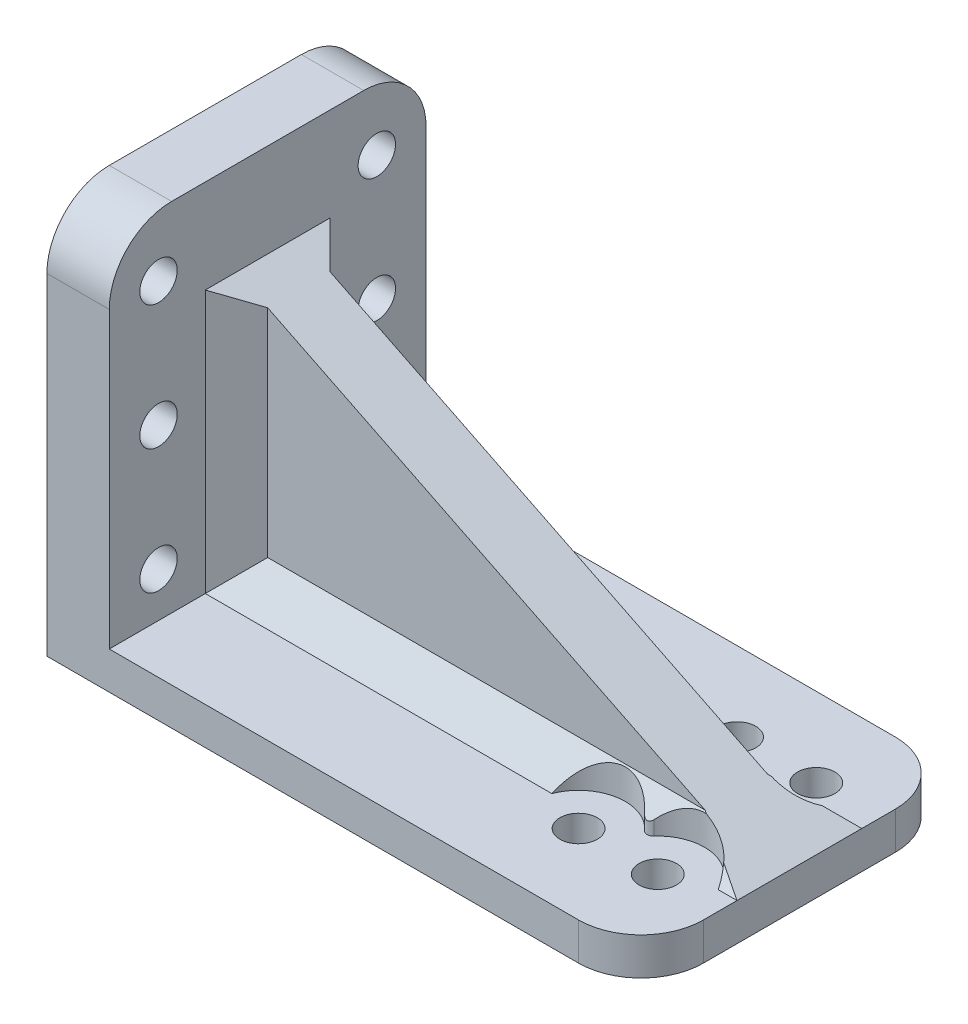
ISO-10303-21;
HEADER;
FILE_DESCRIPTION(('STEP AP214'),'2;1');
FILE_NAME('part.step','',(''),(''),'','','');
FILE_SCHEMA(('AUTOMOTIVE_DESIGN { 1 0 10303 214 1 1 1 1 }'));
ENDSEC;
DATA;
#1=APPLICATION_CONTEXT('core data for automotive mechanical design processes');
#2=APPLICATION_PROTOCOL_DEFINITION('international standard','automotive_design',2000,#1);
#3=PRODUCT_CONTEXT('',#1,'mechanical');
#4=PRODUCT('Part','Part','',(#3));
#5=PRODUCT_RELATED_PRODUCT_CATEGORY('part','',(#4));
#6=PRODUCT_DEFINITION_FORMATION('','',#4);
#7=PRODUCT_DEFINITION_CONTEXT('part definition',#1,'design');
#8=PRODUCT_DEFINITION('design','',#6,#7);
#9=PRODUCT_DEFINITION_SHAPE('','',#8);
#10=(LENGTH_UNIT() NAMED_UNIT(*) SI_UNIT(.MILLI.,.METRE.));
#11=(NAMED_UNIT(*) PLANE_ANGLE_UNIT() SI_UNIT($,.RADIAN.));
#12=(NAMED_UNIT(*) SI_UNIT($,.STERADIAN.) SOLID_ANGLE_UNIT());
#13=UNCERTAINTY_MEASURE_WITH_UNIT(LENGTH_MEASURE(1.E-05),#10,'distance_accuracy_value','');
#14=(GEOMETRIC_REPRESENTATION_CONTEXT(3) GLOBAL_UNCERTAINTY_ASSIGNED_CONTEXT((#13)) GLOBAL_UNIT_ASSIGNED_CONTEXT((#10,
#11,#12)) REPRESENTATION_CONTEXT('',''));
#15=CARTESIAN_POINT('',(0.,0.,0.));
#16=DIRECTION('',(0.,0.,1.));
#17=DIRECTION('',(1.,0.,0.));
#18=AXIS2_PLACEMENT_3D('',#15,#16,#17);
#19=CARTESIAN_POINT('',(0.,7.99999999999998,5.));
#20=DIRECTION('',(0.,0.707106781186551,0.707106781186544));
#21=DIRECTION('',(-1.,0.,0.));
#22=AXIS2_PLACEMENT_3D('',#19,#20,#21);
#23=PLANE('',#22);
#24=CARTESIAN_POINT('',(37.625,0.300000000000029,12.7));
#25=DIRECTION('',(0.,0.707106781186551,0.707106781186544));
#26=DIRECTION('',(0.,-0.707106781186544,0.707106781186551));
#27=AXIS2_PLACEMENT_3D('',#24,#25,#26);
#28=ELLIPSE('',#27,10.6066017177982,7.5);
#29=CARTESIAN_POINT('',(44.6221422738144,3.,10.));
#30=VERTEX_POINT('',#29);
#31=CARTESIAN_POINT('',(43.3948953454556,5.09148282919706,7.90851717080294));
#32=VERTEX_POINT('',#31);
#33=EDGE_CURVE('E266',#30,#32,#28,.T.);
#34=ORIENTED_EDGE('',*,*,#33,.F.);
#35=DIRECTION('',(-1.,0.,0.));
#36=VECTOR('',#35,1.);
#37=CARTESIAN_POINT('',(-37.625,3.,10.));
#38=LINE('',#37,#36);
#39=CARTESIAN_POINT('',(47.625,3.,10.));
#40=VERTEX_POINT('',#39);
#41=EDGE_CURVE('E216',#40,#30,#38,.T.);
#42=ORIENTED_EDGE('',*,*,#41,.F.);
#43=DIRECTION('',(0.819529426312242,-0.405198420164939,0.405198420164942));
#44=VECTOR('',#43,1.);
#45=CARTESIAN_POINT('',(12.3179733236176,20.4567879696131,-7.45678796961326));
#46=LINE('',#45,#44);
#47=EDGE_CURVE('E228',#32,#40,#46,.T.);
#48=ORIENTED_EDGE('',*,*,#47,.F.);
#49=EDGE_LOOP('',(#34,#42,#48));
#50=FACE_BOUND('',#49,.T.);
#51=ADVANCED_FACE('F37',(#50),#23,.T.);
#52=CARTESIAN_POINT('',(24.925,0.300000000000029,12.7));
#53=DIRECTION('',(0.,0.707106781186551,0.707106781186544));
#54=DIRECTION('',(0.,-0.707106781186544,0.707106781186551));
#55=AXIS2_PLACEMENT_3D('',#52,#53,#54);
#56=ELLIPSE('',#55,10.6066017177982,7.5);
#57=CARTESIAN_POINT('',(30.5279411764706,5.28568452401576,7.71431547598423));
#58=VERTEX_POINT('',#57);
#59=CARTESIAN_POINT('',(17.9278577261856,3.,10.));
#60=VERTEX_POINT('',#59);
#61=EDGE_CURVE('E204',#58,#60,#56,.T.);
#62=ORIENTED_EDGE('',*,*,#61,.F.);
#63=CARTESIAN_POINT('',(31.275,5.95044246055119,7.04955753944879));
#64=DIRECTION('',(0.,0.707106781186551,0.707106781186544));
#65=DIRECTION('',(0.,-0.707106781186544,0.707106781186551));
#66=AXIS2_PLACEMENT_3D('',#63,#64,#65);
#67=ELLIPSE('',#66,1.41421356237309,1.);
#68=CARTESIAN_POINT('',(32.0220588235294,5.28568452401576,7.71431547598423));
#69=VERTEX_POINT('',#68);
#70=EDGE_CURVE('E314',#58,#69,#67,.T.);
#71=ORIENTED_EDGE('',*,*,#70,.T.);
#72=CARTESIAN_POINT('',(37.9293061995151,7.79382397290837,5.20617602709161));
#73=VERTEX_POINT('',#72);
#74=EDGE_CURVE('E208',#73,#69,#28,.T.);
#75=ORIENTED_EDGE('',*,*,#74,.F.);
#76=CARTESIAN_POINT('',(37.5123072360617,7.99999999999998,5.));
#77=VERTEX_POINT('',#76);
#78=EDGE_CURVE('E229',#77,#73,#46,.T.);
#79=ORIENTED_EDGE('',*,*,#78,.F.);
#80=DIRECTION('',(1.,0.,0.));
#81=VECTOR('',#80,1.);
#82=CARTESIAN_POINT('',(47.625,7.99999999999998,5.));
#83=LINE('',#82,#81);
#84=CARTESIAN_POINT('',(-32.625,7.99999999999998,5.));
#85=VERTEX_POINT('',#84);
#86=EDGE_CURVE('E217',#85,#77,#83,.T.);
#87=ORIENTED_EDGE('',*,*,#86,.F.);
#88=DIRECTION('',(-0.577350269189624,-0.577350269189624,0.577350269189629));
#89=VECTOR('',#88,1.);
#90=CARTESIAN_POINT('',(-21.7500000000001,18.8749999999999,-5.87500000000004));
#91=LINE('',#90,#89);
#92=CARTESIAN_POINT('',(-37.625,3.,10.));
#93=VERTEX_POINT('',#92);
#94=EDGE_CURVE('E215',#85,#93,#91,.T.);
#95=ORIENTED_EDGE('',*,*,#94,.T.);
#96=EDGE_CURVE('E199',#60,#93,#38,.T.);
#97=ORIENTED_EDGE('',*,*,#96,.F.);
#98=EDGE_LOOP('',(#62,#71,#75,#79,#87,#95,#97));
#99=FACE_BOUND('',#98,.T.);
#100=ADVANCED_FACE('F212',(#99),#23,.T.);
#101=CARTESIAN_POINT('',(0.,3.,-10.));
#102=DIRECTION('',(0.,-0.70710678118655,0.707106781186545));
#103=DIRECTION('',(1.,0.,0.));
#104=AXIS2_PLACEMENT_3D('',#101,#102,#103);
#105=PLANE('',#104);
#106=CARTESIAN_POINT('',(37.625,0.300000000000036,-12.7));
#107=DIRECTION('',(0.,-0.70710678118655,0.707106781186545));
#108=DIRECTION('',(0.,-0.707106781186545,-0.70710678118655));
#109=AXIS2_PLACEMENT_3D('',#106,#107,#108);
#110=ELLIPSE('',#109,10.6066017177982,7.5);
#111=CARTESIAN_POINT('',(32.0220588235294,5.28568452401577,-7.71431547598423));
#112=VERTEX_POINT('',#111);
#113=CARTESIAN_POINT('',(37.9293061995151,7.79382397290838,-5.20617602709159));
#114=VERTEX_POINT('',#113);
#115=EDGE_CURVE('E261',#112,#114,#110,.F.);
#116=ORIENTED_EDGE('',*,*,#115,.F.);
#117=CARTESIAN_POINT('',(31.275,5.9504424605512,-7.04955753944879));
#118=DIRECTION('',(0.,-0.70710678118655,0.707106781186545));
#119=DIRECTION('',(0.,-0.707106781186545,-0.70710678118655));
#120=AXIS2_PLACEMENT_3D('',#117,#118,#119);
#121=ELLIPSE('',#120,1.41421356237309,1.);
#122=CARTESIAN_POINT('',(30.5279411764706,5.28568452401576,-7.71431547598423));
#123=VERTEX_POINT('',#122);
#124=EDGE_CURVE('E308',#112,#123,#121,.F.);
#125=ORIENTED_EDGE('',*,*,#124,.T.);
#126=CARTESIAN_POINT('',(24.925,0.300000000000036,-12.7));
#127=DIRECTION('',(0.,-0.70710678118655,0.707106781186545));
#128=DIRECTION('',(0.,-0.707106781186545,-0.70710678118655));
#129=AXIS2_PLACEMENT_3D('',#126,#127,#128);
#130=ELLIPSE('',#129,10.6066017177982,7.5);
#131=CARTESIAN_POINT('',(17.9278577261856,3.,-10.));
#132=VERTEX_POINT('',#131);
#133=EDGE_CURVE('E209',#132,#123,#130,.F.);
#134=ORIENTED_EDGE('',*,*,#133,.F.);
#135=DIRECTION('',(1.,0.,0.));
#136=VECTOR('',#135,1.);
#137=CARTESIAN_POINT('',(0.,3.,-10.));
#138=LINE('',#137,#136);
#139=CARTESIAN_POINT('',(-37.625,3.,-10.));
#140=VERTEX_POINT('',#139);
#141=EDGE_CURVE('E245',#140,#132,#138,.T.);
#142=ORIENTED_EDGE('',*,*,#141,.F.);
#143=DIRECTION('',(-0.577350269189624,-0.577350269189624,-0.577350269189629));
#144=VECTOR('',#143,1.);
#145=CARTESIAN_POINT('',(-25.7666666666667,14.8583333333333,1.85833333333336));
#146=LINE('',#145,#144);
#147=CARTESIAN_POINT('',(-32.625,7.99999999999998,-5.));
#148=VERTEX_POINT('',#147);
#149=EDGE_CURVE('E237',#148,#140,#146,.T.);
#150=ORIENTED_EDGE('',*,*,#149,.F.);
#151=DIRECTION('',(-1.,0.,0.));
#152=VECTOR('',#151,1.);
#153=CARTESIAN_POINT('',(0.,7.99999999999998,-5.));
#154=LINE('',#153,#152);
#155=CARTESIAN_POINT('',(37.5123072360617,7.99999999999998,-5.));
#156=VERTEX_POINT('',#155);
#157=EDGE_CURVE('E234',#156,#148,#154,.T.);
#158=ORIENTED_EDGE('',*,*,#157,.F.);
#159=DIRECTION('',(0.819529426312242,-0.405198420164939,-0.405198420164942));
#160=VECTOR('',#159,1.);
#161=CARTESIAN_POINT('',(15.6386936118216,18.8149303725715,5.81493037257162));
#162=LINE('',#161,#160);
#163=EDGE_CURVE('E251',#114,#156,#162,.F.);
#164=ORIENTED_EDGE('',*,*,#163,.F.);
#165=EDGE_LOOP('',(#116,#125,#134,#142,#150,#158,#164));
#166=FACE_BOUND('',#165,.T.);
#167=ADVANCED_FACE('F336',(#166),#105,.F.);
#168=CARTESIAN_POINT('',(43.3948953454556,5.09148282919704,-7.90851717080296));
#169=VERTEX_POINT('',#168);
#170=CARTESIAN_POINT('',(44.6221422738144,3.,-10.));
#171=VERTEX_POINT('',#170);
#172=EDGE_CURVE('E255',#169,#171,#110,.F.);
#173=ORIENTED_EDGE('',*,*,#172,.F.);
#174=CARTESIAN_POINT('',(47.625,3.,-10.));
#175=VERTEX_POINT('',#174);
#176=EDGE_CURVE('E252',#175,#169,#162,.F.);
#177=ORIENTED_EDGE('',*,*,#176,.F.);
#178=EDGE_CURVE('E244',#171,#175,#138,.T.);
#179=ORIENTED_EDGE('',*,*,#178,.F.);
#180=EDGE_LOOP('',(#173,#177,#179));
#181=FACE_BOUND('',#180,.T.);
#182=ADVANCED_FACE('F474',(#181),#105,.F.);
#183=CARTESIAN_POINT('',(24.925,-3.,-12.7));
#184=DIRECTION('',(0.,1.,0.));
#185=DIRECTION('',(0.,0.,1.));
#186=AXIS2_PLACEMENT_3D('',#183,#184,#185);
#187=CYLINDRICAL_SURFACE('',#186,3.);
#188=CARTESIAN_POINT('',(24.925,-3.,-12.7));
#189=DIRECTION('',(0.,1.,0.));
#190=DIRECTION('',(0.,0.,1.));
#191=AXIS2_PLACEMENT_3D('',#188,#189,#190);
#192=CIRCLE('',#191,3.);
#193=CARTESIAN_POINT('',(24.925,-3.,-9.7));
#194=VERTEX_POINT('',#193);
#195=EDGE_CURVE('E357',#194,#194,#192,.T.);
#196=ORIENTED_EDGE('',*,*,#195,.F.);
#197=EDGE_LOOP('',(#196));
#198=FACE_BOUND('',#197,.T.);
#199=CARTESIAN_POINT('',(24.925,3.,-12.7));
#200=DIRECTION('',(0.,1.,0.));
#201=DIRECTION('',(0.,0.,1.));
#202=AXIS2_PLACEMENT_3D('',#199,#200,#201);
#203=CIRCLE('',#202,3.);
#204=CARTESIAN_POINT('',(24.925,3.,-9.7));
#205=VERTEX_POINT('',#204);
#206=EDGE_CURVE('E365',#205,#205,#203,.T.);
#207=ORIENTED_EDGE('',*,*,#206,.T.);
#208=EDGE_LOOP('',(#207));
#209=FACE_BOUND('',#208,.T.);
#210=ADVANCED_FACE('F656',(#198,#209),#187,.F.);
#211=CARTESIAN_POINT('',(37.625,-3.,-12.7));
#212=DIRECTION('',(0.,1.,0.));
#213=DIRECTION('',(0.,0.,1.));
#214=AXIS2_PLACEMENT_3D('',#211,#212,#213);
#215=CYLINDRICAL_SURFACE('',#214,3.);
#216=CARTESIAN_POINT('',(37.625,-3.,-12.7));
#217=DIRECTION('',(0.,1.,0.));
#218=DIRECTION('',(0.,0.,1.));
#219=AXIS2_PLACEMENT_3D('',#216,#217,#218);
#220=CIRCLE('',#219,3.);
#221=CARTESIAN_POINT('',(37.625,-3.,-9.7));
#222=VERTEX_POINT('',#221);
#223=EDGE_CURVE('E353',#222,#222,#220,.T.);
#224=ORIENTED_EDGE('',*,*,#223,.F.);
#225=EDGE_LOOP('',(#224));
#226=FACE_BOUND('',#225,.T.);
#227=CARTESIAN_POINT('',(37.625,3.,-12.7));
#228=DIRECTION('',(0.,1.,0.));
#229=DIRECTION('',(0.,0.,1.));
#230=AXIS2_PLACEMENT_3D('',#227,#228,#229);
#231=CIRCLE('',#230,3.);
#232=CARTESIAN_POINT('',(37.625,3.,-9.7));
#233=VERTEX_POINT('',#232);
#234=EDGE_CURVE('E368',#233,#233,#231,.T.);
#235=ORIENTED_EDGE('',*,*,#234,.T.);
#236=EDGE_LOOP('',(#235));
#237=FACE_BOUND('',#236,.T.);
#238=ADVANCED_FACE('F659',(#226,#237),#215,.F.);
#239=CARTESIAN_POINT('',(24.925,-3.,12.7));
#240=DIRECTION('',(0.,1.,0.));
#241=DIRECTION('',(0.,0.,1.));
#242=AXIS2_PLACEMENT_3D('',#239,#240,#241);
#243=CYLINDRICAL_SURFACE('',#242,3.);
#244=CARTESIAN_POINT('',(24.925,-3.,12.7));
#245=DIRECTION('',(0.,1.,0.));
#246=DIRECTION('',(0.,0.,1.));
#247=AXIS2_PLACEMENT_3D('',#244,#245,#246);
#248=CIRCLE('',#247,3.);
#249=CARTESIAN_POINT('',(24.925,-3.,15.7));
#250=VERTEX_POINT('',#249);
#251=EDGE_CURVE('E354',#250,#250,#248,.T.);
#252=ORIENTED_EDGE('',*,*,#251,.F.);
#253=EDGE_LOOP('',(#252));
#254=FACE_BOUND('',#253,.T.);
#255=CARTESIAN_POINT('',(24.925,3.,12.7));
#256=DIRECTION('',(0.,1.,0.));
#257=DIRECTION('',(0.,0.,1.));
#258=AXIS2_PLACEMENT_3D('',#255,#256,#257);
#259=CIRCLE('',#258,3.);
#260=CARTESIAN_POINT('',(24.925,3.,15.7));
#261=VERTEX_POINT('',#260);
#262=EDGE_CURVE('E371',#261,#261,#259,.T.);
#263=ORIENTED_EDGE('',*,*,#262,.T.);
#264=EDGE_LOOP('',(#263));
#265=FACE_BOUND('',#264,.T.);
#266=ADVANCED_FACE('F667',(#254,#265),#243,.F.);
#267=CARTESIAN_POINT('',(37.625,-3.,12.7));
#268=DIRECTION('',(0.,1.,0.));
#269=DIRECTION('',(0.,0.,1.));
#270=AXIS2_PLACEMENT_3D('',#267,#268,#269);
#271=CYLINDRICAL_SURFACE('',#270,3.);
#272=CARTESIAN_POINT('',(37.625,-3.,12.7));
#273=DIRECTION('',(0.,1.,0.));
#274=DIRECTION('',(0.,0.,1.));
#275=AXIS2_PLACEMENT_3D('',#272,#273,#274);
#276=CIRCLE('',#275,3.);
#277=CARTESIAN_POINT('',(37.625,-3.,15.7));
#278=VERTEX_POINT('',#277);
#279=EDGE_CURVE('E358',#278,#278,#276,.T.);
#280=ORIENTED_EDGE('',*,*,#279,.F.);
#281=EDGE_LOOP('',(#280));
#282=FACE_BOUND('',#281,.T.);
#283=CARTESIAN_POINT('',(37.625,3.,12.7));
#284=DIRECTION('',(0.,1.,0.));
#285=DIRECTION('',(0.,0.,1.));
#286=AXIS2_PLACEMENT_3D('',#283,#284,#285);
#287=CIRCLE('',#286,3.);
#288=CARTESIAN_POINT('',(37.625,3.,15.7));
#289=VERTEX_POINT('',#288);
#290=EDGE_CURVE('E258',#289,#289,#287,.T.);
#291=ORIENTED_EDGE('',*,*,#290,.T.);
#292=EDGE_LOOP('',(#291));
#293=FACE_BOUND('',#292,.T.);
#294=ADVANCED_FACE('F663',(#282,#293),#271,.F.);
#295=CARTESIAN_POINT('',(0.,3.,25.4));
#296=DIRECTION('',(0.,1.,0.));
#297=DIRECTION('',(0.,0.,1.));
#298=AXIS2_PLACEMENT_3D('',#295,#296,#297);
#299=PLANE('',#298);
#300=DIRECTION('',(0.,0.,-1.));
#301=VECTOR('',#300,1.);
#302=CARTESIAN_POINT('',(47.625,3.,25.4));
#303=LINE('',#302,#301);
#304=CARTESIAN_POINT('',(47.625,3.,-15.4));
#305=VERTEX_POINT('',#304);
#306=EDGE_CURVE('E416',#175,#305,#303,.T.);
#307=ORIENTED_EDGE('',*,*,#306,.T.);
#308=CARTESIAN_POINT('',(37.625,3.,-15.4));
#309=DIRECTION('',(0.,1.,0.));
#310=DIRECTION('',(0.,0.,1.));
#311=AXIS2_PLACEMENT_3D('',#308,#309,#310);
#312=CIRCLE('',#311,10.);
#313=CARTESIAN_POINT('',(37.625,3.,-25.4));
#314=VERTEX_POINT('',#313);
#315=EDGE_CURVE('E279',#305,#314,#312,.T.);
#316=ORIENTED_EDGE('',*,*,#315,.T.);
#317=DIRECTION('',(1.,0.,0.));
#318=VECTOR('',#317,1.);
#319=CARTESIAN_POINT('',(0.,3.,-25.4));
#320=LINE('',#319,#318);
#321=CARTESIAN_POINT('',(-37.625,3.,-25.4));
#322=VERTEX_POINT('',#321);
#323=EDGE_CURVE('E403',#322,#314,#320,.T.);
#324=ORIENTED_EDGE('',*,*,#323,.F.);
#325=DIRECTION('',(0.,0.,-1.));
#326=VECTOR('',#325,1.);
#327=CARTESIAN_POINT('',(-37.625,3.,25.4));
#328=LINE('',#327,#326);
#329=EDGE_CURVE('E413',#140,#322,#328,.T.);
#330=ORIENTED_EDGE('',*,*,#329,.F.);
#331=ORIENTED_EDGE('',*,*,#141,.T.);
#332=CARTESIAN_POINT('',(24.925,3.,-12.7));
#333=DIRECTION('',(0.,1.,0.));
#334=DIRECTION('',(0.,0.,1.));
#335=AXIS2_PLACEMENT_3D('',#332,#333,#334);
#336=CIRCLE('',#335,7.5);
#337=CARTESIAN_POINT('',(30.5279411764706,3.,-7.71431547598423));
#338=VERTEX_POINT('',#337);
#339=EDGE_CURVE('E322',#132,#338,#336,.T.);
#340=ORIENTED_EDGE('',*,*,#339,.T.);
#341=CARTESIAN_POINT('',(31.275,3.,-7.04955753944879));
#342=DIRECTION('',(0.,1.,0.));
#343=DIRECTION('',(0.,0.,1.));
#344=AXIS2_PLACEMENT_3D('',#341,#342,#343);
#345=CIRCLE('',#344,1.);
#346=CARTESIAN_POINT('',(32.0220588235294,3.,-7.71431547598423));
#347=VERTEX_POINT('',#346);
#348=EDGE_CURVE('E45',#338,#347,#345,.F.);
#349=ORIENTED_EDGE('',*,*,#348,.T.);
#350=CARTESIAN_POINT('',(37.625,3.,-12.7));
#351=DIRECTION('',(0.,1.,0.));
#352=DIRECTION('',(0.,0.,1.));
#353=AXIS2_PLACEMENT_3D('',#350,#351,#352);
#354=CIRCLE('',#353,7.5);
#355=EDGE_CURVE('E321',#347,#171,#354,.T.);
#356=ORIENTED_EDGE('',*,*,#355,.T.);
#357=ORIENTED_EDGE('',*,*,#178,.T.);
#358=EDGE_LOOP('',(#307,#316,#324,#330,#331,#340,#349,#356,#357));
#359=FACE_BOUND('',#358,.T.);
#360=ORIENTED_EDGE('',*,*,#234,.F.);
#361=EDGE_LOOP('',(#360));
#362=FACE_BOUND('',#361,.T.);
#363=ORIENTED_EDGE('',*,*,#206,.F.);
#364=EDGE_LOOP('',(#363));
#365=FACE_BOUND('',#364,.T.);
#366=ADVANCED_FACE('F319',(#359,#362,#365),#299,.T.);
#367=CARTESIAN_POINT('',(-47.625,0.,25.4));
#368=DIRECTION('',(-1.,0.,0.));
#369=DIRECTION('',(0.,0.,1.));
#370=AXIS2_PLACEMENT_3D('',#367,#368,#369);
#371=PLANE('',#370);
#372=CARTESIAN_POINT('',(-47.625,50.15,-17.5));
#373=DIRECTION('',(-1.,0.,0.));
#374=DIRECTION('',(0.,0.,1.));
#375=AXIS2_PLACEMENT_3D('',#372,#373,#374);
#376=CIRCLE('',#375,3.);
#377=CARTESIAN_POINT('',(-47.625,50.15,-14.5));
#378=VERTEX_POINT('',#377);
#379=EDGE_CURVE('E501',#378,#378,#376,.F.);
#380=ORIENTED_EDGE('',*,*,#379,.T.);
#381=EDGE_LOOP('',(#380));
#382=FACE_BOUND('',#381,.T.);
#383=CARTESIAN_POINT('',(-47.625,30.15,-17.5));
#384=DIRECTION('',(-1.,0.,0.));
#385=DIRECTION('',(0.,0.,1.));
#386=AXIS2_PLACEMENT_3D('',#383,#384,#385);
#387=CIRCLE('',#386,3.);
#388=CARTESIAN_POINT('',(-47.625,30.15,-14.5));
#389=VERTEX_POINT('',#388);
#390=EDGE_CURVE('E495',#389,#389,#387,.F.);
#391=ORIENTED_EDGE('',*,*,#390,.T.);
#392=EDGE_LOOP('',(#391));
#393=FACE_BOUND('',#392,.T.);
#394=CARTESIAN_POINT('',(-47.625,30.15,17.5));
#395=DIRECTION('',(-1.,0.,0.));
#396=DIRECTION('',(0.,0.,1.));
#397=AXIS2_PLACEMENT_3D('',#394,#395,#396);
#398=CIRCLE('',#397,3.);
#399=CARTESIAN_POINT('',(-47.625,30.15,20.5));
#400=VERTEX_POINT('',#399);
#401=EDGE_CURVE('E489',#400,#400,#398,.F.);
#402=ORIENTED_EDGE('',*,*,#401,.T.);
#403=EDGE_LOOP('',(#402));
#404=FACE_BOUND('',#403,.T.);
#405=CARTESIAN_POINT('',(-47.625,10.15,17.5));
#406=DIRECTION('',(-1.,0.,0.));
#407=DIRECTION('',(0.,0.,1.));
#408=AXIS2_PLACEMENT_3D('',#405,#406,#407);
#409=CIRCLE('',#408,3.);
#410=CARTESIAN_POINT('',(-47.625,10.15,20.5));
#411=VERTEX_POINT('',#410);
#412=EDGE_CURVE('E482',#411,#411,#409,.F.);
#413=ORIENTED_EDGE('',*,*,#412,.T.);
#414=EDGE_LOOP('',(#413));
#415=FACE_BOUND('',#414,.T.);
#416=CARTESIAN_POINT('',(-47.625,10.15,-17.5));
#417=DIRECTION('',(-1.,0.,0.));
#418=DIRECTION('',(0.,0.,1.));
#419=AXIS2_PLACEMENT_3D('',#416,#417,#418);
#420=CIRCLE('',#419,3.);
#421=CARTESIAN_POINT('',(-47.625,10.15,-14.5));
#422=VERTEX_POINT('',#421);
#423=EDGE_CURVE('E506',#422,#422,#420,.F.);
#424=ORIENTED_EDGE('',*,*,#423,.T.);
#425=EDGE_LOOP('',(#424));
#426=FACE_BOUND('',#425,.T.);
#427=CARTESIAN_POINT('',(-47.625,50.15,17.5));
#428=DIRECTION('',(-1.,0.,0.));
#429=DIRECTION('',(0.,0.,1.));
#430=AXIS2_PLACEMENT_3D('',#427,#428,#429);
#431=CIRCLE('',#430,3.);
#432=CARTESIAN_POINT('',(-47.625,50.15,20.5));
#433=VERTEX_POINT('',#432);
#434=EDGE_CURVE('E344',#433,#433,#431,.F.);
#435=ORIENTED_EDGE('',*,*,#434,.T.);
#436=EDGE_LOOP('',(#435));
#437=FACE_BOUND('',#436,.T.);
#438=DIRECTION('',(0.,0.,-1.));
#439=VECTOR('',#438,1.);
#440=CARTESIAN_POINT('',(-47.625,60.15,25.4));
#441=LINE('',#440,#439);
#442=CARTESIAN_POINT('',(-47.625,60.15,15.4));
#443=VERTEX_POINT('',#442);
#444=CARTESIAN_POINT('',(-47.625,60.15,-15.4));
#445=VERTEX_POINT('',#444);
#446=EDGE_CURVE('E397',#443,#445,#441,.T.);
#447=ORIENTED_EDGE('',*,*,#446,.T.);
#448=CARTESIAN_POINT('',(-47.625,50.15,-15.4));
#449=DIRECTION('',(-1.,0.,0.));
#450=DIRECTION('',(0.,0.,1.));
#451=AXIS2_PLACEMENT_3D('',#448,#449,#450);
#452=CIRCLE('',#451,10.);
#453=CARTESIAN_POINT('',(-47.625,50.15,-25.4));
#454=VERTEX_POINT('',#453);
#455=EDGE_CURVE('E299',#445,#454,#452,.T.);
#456=ORIENTED_EDGE('',*,*,#455,.T.);
#457=DIRECTION('',(0.,1.,0.));
#458=VECTOR('',#457,1.);
#459=CARTESIAN_POINT('',(-47.625,0.,-25.4));
#460=LINE('',#459,#458);
#461=CARTESIAN_POINT('',(-47.625,-3.,-25.4));
#462=VERTEX_POINT('',#461);
#463=EDGE_CURVE('E384',#462,#454,#460,.T.);
#464=ORIENTED_EDGE('',*,*,#463,.F.);
#465=DIRECTION('',(0.,0.,-1.));
#466=VECTOR('',#465,1.);
#467=CARTESIAN_POINT('',(-47.625,-3.,25.4));
#468=LINE('',#467,#466);
#469=CARTESIAN_POINT('',(-47.625,-3.,25.4));
#470=VERTEX_POINT('',#469);
#471=EDGE_CURVE('E422',#470,#462,#468,.T.);
#472=ORIENTED_EDGE('',*,*,#471,.F.);
#473=DIRECTION('',(0.,1.,0.));
#474=VECTOR('',#473,1.);
#475=CARTESIAN_POINT('',(-47.625,0.,25.4));
#476=LINE('',#475,#474);
#477=CARTESIAN_POINT('',(-47.625,50.15,25.4));
#478=VERTEX_POINT('',#477);
#479=EDGE_CURVE('E385',#470,#478,#476,.T.);
#480=ORIENTED_EDGE('',*,*,#479,.T.);
#481=CARTESIAN_POINT('',(-47.625,50.15,15.4));
#482=DIRECTION('',(-1.,0.,0.));
#483=DIRECTION('',(0.,0.,1.));
#484=AXIS2_PLACEMENT_3D('',#481,#482,#483);
#485=CIRCLE('',#484,10.);
#486=EDGE_CURVE('E297',#478,#443,#485,.T.);
#487=ORIENTED_EDGE('',*,*,#486,.T.);
#488=EDGE_LOOP('',(#447,#456,#464,#472,#480,#487));
#489=FACE_BOUND('',#488,.T.);
#490=ADVANCED_FACE('F551',(#382,#393,#404,#415,#426,#437,#489),#371,.T.);
#491=CARTESIAN_POINT('',(0.,-3.,25.4));
#492=DIRECTION('',(0.,1.,0.));
#493=DIRECTION('',(0.,0.,1.));
#494=AXIS2_PLACEMENT_3D('',#491,#492,#493);
#495=PLANE('',#494);
#496=ORIENTED_EDGE('',*,*,#223,.T.);
#497=EDGE_LOOP('',(#496));
#498=FACE_BOUND('',#497,.T.);
#499=ORIENTED_EDGE('',*,*,#279,.T.);
#500=EDGE_LOOP('',(#499));
#501=FACE_BOUND('',#500,.T.);
#502=ORIENTED_EDGE('',*,*,#251,.T.);
#503=EDGE_LOOP('',(#502));
#504=FACE_BOUND('',#503,.T.);
#505=ORIENTED_EDGE('',*,*,#195,.T.);
#506=EDGE_LOOP('',(#505));
#507=FACE_BOUND('',#506,.T.);
#508=DIRECTION('',(1.,0.,0.));
#509=VECTOR('',#508,1.);
#510=CARTESIAN_POINT('',(0.,-3.,-25.4));
#511=LINE('',#510,#509);
#512=CARTESIAN_POINT('',(37.625,-3.,-25.4));
#513=VERTEX_POINT('',#512);
#514=EDGE_CURVE('E400',#462,#513,#511,.T.);
#515=ORIENTED_EDGE('',*,*,#514,.T.);
#516=CARTESIAN_POINT('',(37.625,-3.,-15.4));
#517=DIRECTION('',(0.,1.,0.));
#518=DIRECTION('',(0.,0.,1.));
#519=AXIS2_PLACEMENT_3D('',#516,#517,#518);
#520=CIRCLE('',#519,10.);
#521=CARTESIAN_POINT('',(47.625,-3.,-15.4));
#522=VERTEX_POINT('',#521);
#523=EDGE_CURVE('E272',#513,#522,#520,.F.);
#524=ORIENTED_EDGE('',*,*,#523,.T.);
#525=DIRECTION('',(0.,0.,-1.));
#526=VECTOR('',#525,1.);
#527=CARTESIAN_POINT('',(47.625,-3.,25.4));
#528=LINE('',#527,#526);
#529=CARTESIAN_POINT('',(47.625,-3.,15.4));
#530=VERTEX_POINT('',#529);
#531=EDGE_CURVE('E419',#530,#522,#528,.T.);
#532=ORIENTED_EDGE('',*,*,#531,.F.);
#533=CARTESIAN_POINT('',(37.625,-3.,15.4));
#534=DIRECTION('',(0.,1.,0.));
#535=DIRECTION('',(0.,0.,1.));
#536=AXIS2_PLACEMENT_3D('',#533,#534,#535);
#537=CIRCLE('',#536,10.);
#538=CARTESIAN_POINT('',(37.625,-3.,25.4));
#539=VERTEX_POINT('',#538);
#540=EDGE_CURVE('E270',#530,#539,#537,.F.);
#541=ORIENTED_EDGE('',*,*,#540,.T.);
#542=DIRECTION('',(1.,0.,0.));
#543=VECTOR('',#542,1.);
#544=CARTESIAN_POINT('',(0.,-3.,25.4));
#545=LINE('',#544,#543);
#546=EDGE_CURVE('E388',#470,#539,#545,.T.);
#547=ORIENTED_EDGE('',*,*,#546,.F.);
#548=ORIENTED_EDGE('',*,*,#471,.T.);
#549=EDGE_LOOP('',(#515,#524,#532,#541,#547,#548));
#550=FACE_BOUND('',#549,.T.);
#551=ADVANCED_FACE('F457',(#498,#501,#504,#507,#550),#495,.F.);
#552=CARTESIAN_POINT('',(47.625,0.,25.4));
#553=DIRECTION('',(1.,0.,0.));
#554=DIRECTION('',(0.,0.,-1.));
#555=AXIS2_PLACEMENT_3D('',#552,#553,#554);
#556=PLANE('',#555);
#557=ORIENTED_EDGE('',*,*,#531,.T.);
#558=DIRECTION('',(0.,-1.,0.));
#559=VECTOR('',#558,1.);
#560=CARTESIAN_POINT('',(47.625,3.,-15.4));
#561=LINE('',#560,#559);
#562=EDGE_CURVE('E277',#522,#305,#561,.F.);
#563=ORIENTED_EDGE('',*,*,#562,.T.);
#564=ORIENTED_EDGE('',*,*,#306,.F.);
#565=DIRECTION('',(0.,0.,1.));
#566=VECTOR('',#565,1.);
#567=CARTESIAN_POINT('',(47.625,3.,25.4));
#568=LINE('',#567,#566);
#569=EDGE_CURVE('E379',#40,#175,#568,.F.);
#570=ORIENTED_EDGE('',*,*,#569,.F.);
#571=CARTESIAN_POINT('',(47.625,3.,15.4));
#572=VERTEX_POINT('',#571);
#573=EDGE_CURVE('E417',#572,#40,#303,.T.);
#574=ORIENTED_EDGE('',*,*,#573,.F.);
#575=DIRECTION('',(0.,-1.,0.));
#576=VECTOR('',#575,1.);
#577=CARTESIAN_POINT('',(47.625,0.,15.4));
#578=LINE('',#577,#576);
#579=EDGE_CURVE('E274',#572,#530,#578,.T.);
#580=ORIENTED_EDGE('',*,*,#579,.T.);
#581=EDGE_LOOP('',(#557,#563,#564,#570,#574,#580));
#582=FACE_BOUND('',#581,.T.);
#583=ADVANCED_FACE('F453',(#582),#556,.T.);
#584=DIRECTION('',(1.,0.,0.));
#585=VECTOR('',#584,1.);
#586=CARTESIAN_POINT('',(0.,3.,25.4));
#587=LINE('',#586,#585);
#588=CARTESIAN_POINT('',(-37.625,3.,25.4));
#589=VERTEX_POINT('',#588);
#590=CARTESIAN_POINT('',(37.625,3.,25.4));
#591=VERTEX_POINT('',#590);
#592=EDGE_CURVE('E392',#589,#591,#587,.T.);
#593=ORIENTED_EDGE('',*,*,#592,.T.);
#594=CARTESIAN_POINT('',(37.625,3.,15.4));
#595=DIRECTION('',(0.,1.,0.));
#596=DIRECTION('',(0.,0.,1.));
#597=AXIS2_PLACEMENT_3D('',#594,#595,#596);
#598=CIRCLE('',#597,10.);
#599=EDGE_CURVE('E283',#591,#572,#598,.T.);
#600=ORIENTED_EDGE('',*,*,#599,.T.);
#601=ORIENTED_EDGE('',*,*,#573,.T.);
#602=ORIENTED_EDGE('',*,*,#41,.T.);
#603=CARTESIAN_POINT('',(37.625,3.,12.7));
#604=DIRECTION('',(0.,1.,0.));
#605=DIRECTION('',(0.,0.,1.));
#606=AXIS2_PLACEMENT_3D('',#603,#604,#605);
#607=CIRCLE('',#606,7.5);
#608=CARTESIAN_POINT('',(32.0220588235294,3.,7.71431547598423));
#609=VERTEX_POINT('',#608);
#610=EDGE_CURVE('E202',#30,#609,#607,.T.);
#611=ORIENTED_EDGE('',*,*,#610,.T.);
#612=CARTESIAN_POINT('',(31.275,3.,7.04955753944879));
#613=DIRECTION('',(0.,1.,0.));
#614=DIRECTION('',(0.,0.,1.));
#615=AXIS2_PLACEMENT_3D('',#612,#613,#614);
#616=CIRCLE('',#615,1.);
#617=CARTESIAN_POINT('',(30.5279411764706,3.,7.71431547598423));
#618=VERTEX_POINT('',#617);
#619=EDGE_CURVE('E11',#609,#618,#616,.F.);
#620=ORIENTED_EDGE('',*,*,#619,.T.);
#621=CARTESIAN_POINT('',(24.925,3.,12.7));
#622=DIRECTION('',(0.,1.,0.));
#623=DIRECTION('',(0.,0.,1.));
#624=AXIS2_PLACEMENT_3D('',#621,#622,#623);
#625=CIRCLE('',#624,7.5);
#626=EDGE_CURVE('E194',#618,#60,#625,.T.);
#627=ORIENTED_EDGE('',*,*,#626,.T.);
#628=ORIENTED_EDGE('',*,*,#96,.T.);
#629=EDGE_CURVE('E414',#589,#93,#328,.T.);
#630=ORIENTED_EDGE('',*,*,#629,.F.);
#631=EDGE_LOOP('',(#593,#600,#601,#602,#611,#620,#627,#628,#630));
#632=FACE_BOUND('',#631,.T.);
#633=ORIENTED_EDGE('',*,*,#262,.F.);
#634=EDGE_LOOP('',(#633));
#635=FACE_BOUND('',#634,.T.);
#636=ORIENTED_EDGE('',*,*,#290,.F.);
#637=EDGE_LOOP('',(#636));
#638=FACE_BOUND('',#637,.T.);
#639=ADVANCED_FACE('F196',(#632,#635,#638),#299,.T.);
#640=CARTESIAN_POINT('',(-37.625,0.,25.4));
#641=DIRECTION('',(-1.,0.,0.));
#642=DIRECTION('',(0.,-1.,0.));
#643=AXIS2_PLACEMENT_3D('',#640,#641,#642);
#644=PLANE('',#643);
#645=CARTESIAN_POINT('',(-37.625,50.15,-17.5));
#646=DIRECTION('',(1.,0.,0.));
#647=DIRECTION('',(0.,1.,0.));
#648=AXIS2_PLACEMENT_3D('',#645,#646,#647);
#649=CIRCLE('',#648,3.);
#650=CARTESIAN_POINT('',(-37.625,53.15,-17.5));
#651=VERTEX_POINT('',#650);
#652=EDGE_CURVE('E480',#651,#651,#649,.T.);
#653=ORIENTED_EDGE('',*,*,#652,.F.);
#654=EDGE_LOOP('',(#653));
#655=FACE_BOUND('',#654,.T.);
#656=CARTESIAN_POINT('',(-37.625,30.15,-17.5));
#657=DIRECTION('',(1.,0.,0.));
#658=DIRECTION('',(0.,1.,0.));
#659=AXIS2_PLACEMENT_3D('',#656,#657,#658);
#660=CIRCLE('',#659,3.);
#661=CARTESIAN_POINT('',(-37.625,33.15,-17.5));
#662=VERTEX_POINT('',#661);
#663=EDGE_CURVE('E498',#662,#662,#660,.T.);
#664=ORIENTED_EDGE('',*,*,#663,.F.);
#665=EDGE_LOOP('',(#664));
#666=FACE_BOUND('',#665,.T.);
#667=CARTESIAN_POINT('',(-37.625,30.15,17.5));
#668=DIRECTION('',(1.,0.,0.));
#669=DIRECTION('',(0.,1.,0.));
#670=AXIS2_PLACEMENT_3D('',#667,#668,#669);
#671=CIRCLE('',#670,3.);
#672=CARTESIAN_POINT('',(-37.625,33.15,17.5));
#673=VERTEX_POINT('',#672);
#674=EDGE_CURVE('E492',#673,#673,#671,.T.);
#675=ORIENTED_EDGE('',*,*,#674,.F.);
#676=EDGE_LOOP('',(#675));
#677=FACE_BOUND('',#676,.T.);
#678=CARTESIAN_POINT('',(-37.625,10.15,17.5));
#679=DIRECTION('',(1.,0.,0.));
#680=DIRECTION('',(0.,1.,0.));
#681=AXIS2_PLACEMENT_3D('',#678,#679,#680);
#682=CIRCLE('',#681,3.);
#683=CARTESIAN_POINT('',(-37.625,13.15,17.5));
#684=VERTEX_POINT('',#683);
#685=EDGE_CURVE('E485',#684,#684,#682,.T.);
#686=ORIENTED_EDGE('',*,*,#685,.F.);
#687=EDGE_LOOP('',(#686));
#688=FACE_BOUND('',#687,.T.);
#689=CARTESIAN_POINT('',(-37.625,10.15,-17.5));
#690=DIRECTION('',(1.,0.,0.));
#691=DIRECTION('',(0.,1.,0.));
#692=AXIS2_PLACEMENT_3D('',#689,#690,#691);
#693=CIRCLE('',#692,3.);
#694=CARTESIAN_POINT('',(-37.625,13.15,-17.5));
#695=VERTEX_POINT('',#694);
#696=EDGE_CURVE('E486',#695,#695,#693,.T.);
#697=ORIENTED_EDGE('',*,*,#696,.F.);
#698=EDGE_LOOP('',(#697));
#699=FACE_BOUND('',#698,.T.);
#700=CARTESIAN_POINT('',(-37.625,50.15,17.5));
#701=DIRECTION('',(1.,0.,0.));
#702=DIRECTION('',(0.,1.,0.));
#703=AXIS2_PLACEMENT_3D('',#700,#701,#702);
#704=CIRCLE('',#703,3.);
#705=CARTESIAN_POINT('',(-37.625,53.15,17.5));
#706=VERTEX_POINT('',#705);
#707=EDGE_CURVE('E341',#706,#706,#704,.T.);
#708=ORIENTED_EDGE('',*,*,#707,.F.);
#709=EDGE_LOOP('',(#708));
#710=FACE_BOUND('',#709,.T.);
#711=DIRECTION('',(0.,1.,0.));
#712=VECTOR('',#711,1.);
#713=CARTESIAN_POINT('',(-37.625,0.,-25.4));
#714=LINE('',#713,#712);
#715=CARTESIAN_POINT('',(-37.625,50.15,-25.4));
#716=VERTEX_POINT('',#715);
#717=EDGE_CURVE('E389',#322,#716,#714,.T.);
#718=ORIENTED_EDGE('',*,*,#717,.T.);
#719=CARTESIAN_POINT('',(-37.625,50.15,-15.4));
#720=DIRECTION('',(-1.,0.,0.));
#721=DIRECTION('',(0.,-1.,0.));
#722=AXIS2_PLACEMENT_3D('',#719,#720,#721);
#723=CIRCLE('',#722,10.);
#724=CARTESIAN_POINT('',(-37.625,60.15,-15.4));
#725=VERTEX_POINT('',#724);
#726=EDGE_CURVE('E290',#716,#725,#723,.F.);
#727=ORIENTED_EDGE('',*,*,#726,.T.);
#728=DIRECTION('',(0.,0.,-1.));
#729=VECTOR('',#728,1.);
#730=CARTESIAN_POINT('',(-37.625,60.15,25.4));
#731=LINE('',#730,#729);
#732=CARTESIAN_POINT('',(-37.625,60.15,15.4));
#733=VERTEX_POINT('',#732);
#734=EDGE_CURVE('E410',#733,#725,#731,.T.);
#735=ORIENTED_EDGE('',*,*,#734,.F.);
#736=CARTESIAN_POINT('',(-37.625,50.15,15.4));
#737=DIRECTION('',(-1.,0.,0.));
#738=DIRECTION('',(0.,-1.,0.));
#739=AXIS2_PLACEMENT_3D('',#736,#737,#738);
#740=CIRCLE('',#739,10.);
#741=CARTESIAN_POINT('',(-37.625,50.15,25.4));
#742=VERTEX_POINT('',#741);
#743=EDGE_CURVE('E288',#733,#742,#740,.F.);
#744=ORIENTED_EDGE('',*,*,#743,.T.);
#745=DIRECTION('',(0.,1.,0.));
#746=VECTOR('',#745,1.);
#747=CARTESIAN_POINT('',(-37.625,0.,25.4));
#748=LINE('',#747,#746);
#749=EDGE_CURVE('E394',#589,#742,#748,.T.);
#750=ORIENTED_EDGE('',*,*,#749,.F.);
#751=ORIENTED_EDGE('',*,*,#629,.T.);
#752=DIRECTION('',(0.,1.,0.));
#753=VECTOR('',#752,1.);
#754=CARTESIAN_POINT('',(-37.625,0.,10.));
#755=LINE('',#754,#753);
#756=CARTESIAN_POINT('',(-37.625,45.15,10.));
#757=VERTEX_POINT('',#756);
#758=EDGE_CURVE('E220',#93,#757,#755,.T.);
#759=ORIENTED_EDGE('',*,*,#758,.T.);
#760=DIRECTION('',(0.,0.,1.));
#761=VECTOR('',#760,1.);
#762=CARTESIAN_POINT('',(-37.625,45.15,25.4));
#763=LINE('',#762,#761);
#764=CARTESIAN_POINT('',(-37.625,45.15,-10.));
#765=VERTEX_POINT('',#764);
#766=EDGE_CURVE('E424',#757,#765,#763,.F.);
#767=ORIENTED_EDGE('',*,*,#766,.T.);
#768=DIRECTION('',(0.,-1.,0.));
#769=VECTOR('',#768,1.);
#770=CARTESIAN_POINT('',(-37.625,3.,-10.));
#771=LINE('',#770,#769);
#772=EDGE_CURVE('E242',#765,#140,#771,.T.);
#773=ORIENTED_EDGE('',*,*,#772,.T.);
#774=ORIENTED_EDGE('',*,*,#329,.T.);
#775=EDGE_LOOP('',(#718,#727,#735,#744,#750,#751,#759,#767,#773,#774));
#776=FACE_BOUND('',#775,.T.);
#777=ADVANCED_FACE('F441',(#655,#666,#677,#688,#699,#710,#776),#644,.F.);
#778=CARTESIAN_POINT('',(0.,60.15,25.4));
#779=DIRECTION('',(0.,1.,0.));
#780=DIRECTION('',(0.,0.,1.));
#781=AXIS2_PLACEMENT_3D('',#778,#779,#780);
#782=PLANE('',#781);
#783=ORIENTED_EDGE('',*,*,#734,.T.);
#784=DIRECTION('',(1.,0.,0.));
#785=VECTOR('',#784,1.);
#786=CARTESIAN_POINT('',(-47.625,60.15,-15.4));
#787=LINE('',#786,#785);
#788=EDGE_CURVE('E295',#725,#445,#787,.F.);
#789=ORIENTED_EDGE('',*,*,#788,.T.);
#790=ORIENTED_EDGE('',*,*,#446,.F.);
#791=DIRECTION('',(1.,0.,0.));
#792=VECTOR('',#791,1.);
#793=CARTESIAN_POINT('',(0.,60.15,15.4));
#794=LINE('',#793,#792);
#795=EDGE_CURVE('E292',#443,#733,#794,.T.);
#796=ORIENTED_EDGE('',*,*,#795,.T.);
#797=EDGE_LOOP('',(#783,#789,#790,#796));
#798=FACE_BOUND('',#797,.T.);
#799=ADVANCED_FACE('F516',(#798),#782,.T.);
#800=CARTESIAN_POINT('',(0.,0.,25.4));
#801=DIRECTION('',(0.,0.,1.));
#802=DIRECTION('',(1.,0.,0.));
#803=AXIS2_PLACEMENT_3D('',#800,#801,#802);
#804=PLANE('',#803);
#805=ORIENTED_EDGE('',*,*,#749,.T.);
#806=DIRECTION('',(1.,0.,0.));
#807=VECTOR('',#806,1.);
#808=CARTESIAN_POINT('',(0.,50.15,25.4));
#809=LINE('',#808,#807);
#810=EDGE_CURVE('E301',#742,#478,#809,.F.);
#811=ORIENTED_EDGE('',*,*,#810,.T.);
#812=ORIENTED_EDGE('',*,*,#479,.F.);
#813=ORIENTED_EDGE('',*,*,#546,.T.);
#814=DIRECTION('',(0.,-1.,0.));
#815=VECTOR('',#814,1.);
#816=CARTESIAN_POINT('',(37.625,0.,25.4));
#817=LINE('',#816,#815);
#818=EDGE_CURVE('E281',#539,#591,#817,.F.);
#819=ORIENTED_EDGE('',*,*,#818,.T.);
#820=ORIENTED_EDGE('',*,*,#592,.F.);
#821=EDGE_LOOP('',(#805,#811,#812,#813,#819,#820));
#822=FACE_BOUND('',#821,.T.);
#823=ADVANCED_FACE('F634',(#822),#804,.T.);
#824=CARTESIAN_POINT('',(0.,0.,-25.4));
#825=DIRECTION('',(0.,0.,1.));
#826=DIRECTION('',(1.,0.,0.));
#827=AXIS2_PLACEMENT_3D('',#824,#825,#826);
#828=PLANE('',#827);
#829=ORIENTED_EDGE('',*,*,#463,.T.);
#830=DIRECTION('',(1.,0.,0.));
#831=VECTOR('',#830,1.);
#832=CARTESIAN_POINT('',(-37.625,50.15,-25.4));
#833=LINE('',#832,#831);
#834=EDGE_CURVE('E285',#454,#716,#833,.T.);
#835=ORIENTED_EDGE('',*,*,#834,.T.);
#836=ORIENTED_EDGE('',*,*,#717,.F.);
#837=ORIENTED_EDGE('',*,*,#323,.T.);
#838=DIRECTION('',(0.,-1.,0.));
#839=VECTOR('',#838,1.);
#840=CARTESIAN_POINT('',(37.625,-3.,-25.4));
#841=LINE('',#840,#839);
#842=EDGE_CURVE('E267',#314,#513,#841,.T.);
#843=ORIENTED_EDGE('',*,*,#842,.T.);
#844=ORIENTED_EDGE('',*,*,#514,.F.);
#845=EDGE_LOOP('',(#829,#835,#836,#837,#843,#844));
#846=FACE_BOUND('',#845,.T.);
#847=ADVANCED_FACE('F465',(#846),#828,.F.);
#848=CARTESIAN_POINT('',(-37.625,45.15,0.));
#849=DIRECTION('',(-0.443213377585503,-0.896416143277915,0.));
#850=DIRECTION('',(0.896416143277915,-0.443213377585503,0.));
#851=AXIS2_PLACEMENT_3D('',#848,#849,#850);
#852=PLANE('',#851);
#853=ORIENTED_EDGE('',*,*,#78,.T.);
#854=CARTESIAN_POINT('',(37.625,7.9442815249267,12.7));
#855=DIRECTION('',(-0.443213377585503,-0.896416143277915,0.));
#856=DIRECTION('',(0.896416143277915,-0.443213377585503,0.));
#857=AXIS2_PLACEMENT_3D('',#854,#855,#856);
#858=ELLIPSE('',#857,8.36664986038163,7.5);
#859=EDGE_CURVE('E350',#73,#32,#858,.T.);
#860=ORIENTED_EDGE('',*,*,#859,.T.);
#861=ORIENTED_EDGE('',*,*,#47,.T.);
#862=ORIENTED_EDGE('',*,*,#569,.T.);
#863=ORIENTED_EDGE('',*,*,#176,.T.);
#864=CARTESIAN_POINT('',(37.625,7.9442815249267,-12.7));
#865=DIRECTION('',(-0.443213377585503,-0.896416143277915,0.));
#866=DIRECTION('',(0.896416143277915,-0.443213377585503,0.));
#867=AXIS2_PLACEMENT_3D('',#864,#865,#866);
#868=ELLIPSE('',#867,8.36664986038163,7.5);
#869=EDGE_CURVE('E201',#169,#114,#868,.T.);
#870=ORIENTED_EDGE('',*,*,#869,.T.);
#871=ORIENTED_EDGE('',*,*,#163,.T.);
#872=DIRECTION('',(0.896416143277915,-0.443213377585503,0.));
#873=VECTOR('',#872,1.);
#874=CARTESIAN_POINT('',(-37.625,45.15,-5.));
#875=LINE('',#874,#873);
#876=CARTESIAN_POINT('',(-32.625,42.6778592375367,-5.));
#877=VERTEX_POINT('',#876);
#878=EDGE_CURVE('E236',#877,#156,#875,.T.);
#879=ORIENTED_EDGE('',*,*,#878,.F.);
#880=DIRECTION('',(-0.667489045416943,0.330025375534594,-0.667489045416948));
#881=VECTOR('',#880,1.);
#882=CARTESIAN_POINT('',(-29.5183047907651,41.1418216648768,-1.89330479076506));
#883=LINE('',#882,#881);
#884=EDGE_CURVE('E248',#877,#765,#883,.T.);
#885=ORIENTED_EDGE('',*,*,#884,.T.);
#886=ORIENTED_EDGE('',*,*,#766,.F.);
#887=DIRECTION('',(-0.667489045416943,0.330025375534594,0.667489045416949));
#888=VECTOR('',#887,1.);
#889=CARTESIAN_POINT('',(-27.6789822220152,40.2324088053718,0.053982222015159));
#890=LINE('',#889,#888);
#891=CARTESIAN_POINT('',(-32.625,42.6778592375367,5.));
#892=VERTEX_POINT('',#891);
#893=EDGE_CURVE('E232',#757,#892,#890,.F.);
#894=ORIENTED_EDGE('',*,*,#893,.T.);
#895=DIRECTION('',(0.896416143277915,-0.443213377585503,0.));
#896=VECTOR('',#895,1.);
#897=CARTESIAN_POINT('',(-37.625,45.15,5.));
#898=LINE('',#897,#896);
#899=EDGE_CURVE('E376',#892,#77,#898,.T.);
#900=ORIENTED_EDGE('',*,*,#899,.T.);
#901=EDGE_LOOP('',(#853,#860,#861,#862,#863,#870,#871,#879,#885,#886,#894,#900));
#902=FACE_BOUND('',#901,.T.);
#903=ADVANCED_FACE('F435',(#902),#852,.F.);
#904=CARTESIAN_POINT('',(0.,28.575,5.));
#905=DIRECTION('',(0.,0.,1.));
#906=DIRECTION('',(1.,0.,0.));
#907=AXIS2_PLACEMENT_3D('',#904,#905,#906);
#908=PLANE('',#907);
#909=DIRECTION('',(0.,-1.,0.));
#910=VECTOR('',#909,1.);
#911=CARTESIAN_POINT('',(-32.625,28.575,5.));
#912=LINE('',#911,#910);
#913=EDGE_CURVE('E222',#892,#85,#912,.T.);
#914=ORIENTED_EDGE('',*,*,#913,.T.);
#915=ORIENTED_EDGE('',*,*,#86,.T.);
#916=ORIENTED_EDGE('',*,*,#899,.F.);
#917=EDGE_LOOP('',(#914,#915,#916));
#918=FACE_BOUND('',#917,.T.);
#919=ADVANCED_FACE('F428',(#918),#908,.T.);
#920=CARTESIAN_POINT('',(0.,28.575,-5.));
#921=DIRECTION('',(0.,0.,1.));
#922=DIRECTION('',(1.,0.,0.));
#923=AXIS2_PLACEMENT_3D('',#920,#921,#922);
#924=PLANE('',#923);
#925=ORIENTED_EDGE('',*,*,#157,.T.);
#926=DIRECTION('',(0.,1.,0.));
#927=VECTOR('',#926,1.);
#928=CARTESIAN_POINT('',(-32.625,45.15,-5.));
#929=LINE('',#928,#927);
#930=EDGE_CURVE('E239',#148,#877,#929,.T.);
#931=ORIENTED_EDGE('',*,*,#930,.T.);
#932=ORIENTED_EDGE('',*,*,#878,.T.);
#933=EDGE_LOOP('',(#925,#931,#932));
#934=FACE_BOUND('',#933,.T.);
#935=ADVANCED_FACE('F558',(#934),#924,.F.);
#936=CARTESIAN_POINT('',(-37.625,0.,10.));
#937=DIRECTION('',(-0.707106781186551,0.,-0.707106781186544));
#938=DIRECTION('',(0.,1.,0.));
#939=AXIS2_PLACEMENT_3D('',#936,#937,#938);
#940=PLANE('',#939);
#941=ORIENTED_EDGE('',*,*,#893,.F.);
#942=ORIENTED_EDGE('',*,*,#758,.F.);
#943=ORIENTED_EDGE('',*,*,#94,.F.);
#944=ORIENTED_EDGE('',*,*,#913,.F.);
#945=EDGE_LOOP('',(#941,#942,#943,#944));
#946=FACE_BOUND('',#945,.T.);
#947=ADVANCED_FACE('F432',(#946),#940,.F.);
#948=CARTESIAN_POINT('',(-32.625,28.575,-5.));
#949=DIRECTION('',(0.70710678118655,0.,-0.707106781186544));
#950=DIRECTION('',(0.,-1.,0.));
#951=AXIS2_PLACEMENT_3D('',#948,#949,#950);
#952=PLANE('',#951);
#953=ORIENTED_EDGE('',*,*,#149,.T.);
#954=ORIENTED_EDGE('',*,*,#772,.F.);
#955=ORIENTED_EDGE('',*,*,#884,.F.);
#956=ORIENTED_EDGE('',*,*,#930,.F.);
#957=EDGE_LOOP('',(#953,#954,#955,#956));
#958=FACE_BOUND('',#957,.T.);
#959=ADVANCED_FACE('F557',(#958),#952,.T.);
#960=CARTESIAN_POINT('',(37.625,60.15,12.7));
#961=DIRECTION('',(0.,-1.,0.));
#962=DIRECTION('',(0.,0.,-1.));
#963=AXIS2_PLACEMENT_3D('',#960,#961,#962);
#964=CYLINDRICAL_SURFACE('',#963,7.5);
#965=ORIENTED_EDGE('',*,*,#74,.T.);
#966=DIRECTION('',(0.,-1.,0.));
#967=VECTOR('',#966,1.);
#968=CARTESIAN_POINT('',(32.0220588235294,60.15,7.71431547598423));
#969=LINE('',#968,#967);
#970=EDGE_CURVE('E310',#69,#609,#969,.T.);
#971=ORIENTED_EDGE('',*,*,#970,.T.);
#972=ORIENTED_EDGE('',*,*,#610,.F.);
#973=ORIENTED_EDGE('',*,*,#33,.T.);
#974=ORIENTED_EDGE('',*,*,#859,.F.);
#975=EDGE_LOOP('',(#965,#971,#972,#973,#974));
#976=FACE_BOUND('',#975,.T.);
#977=ADVANCED_FACE('F564',(#976),#964,.F.);
#978=CARTESIAN_POINT('',(24.925,60.15,12.7));
#979=DIRECTION('',(0.,-1.,0.));
#980=DIRECTION('',(0.,0.,-1.));
#981=AXIS2_PLACEMENT_3D('',#978,#979,#980);
#982=CYLINDRICAL_SURFACE('',#981,7.5);
#983=ORIENTED_EDGE('',*,*,#626,.F.);
#984=DIRECTION('',(0.,-1.,0.));
#985=VECTOR('',#984,1.);
#986=CARTESIAN_POINT('',(30.5279411764706,60.15,7.71431547598423));
#987=LINE('',#986,#985);
#988=EDGE_CURVE('E57',#618,#58,#987,.F.);
#989=ORIENTED_EDGE('',*,*,#988,.T.);
#990=ORIENTED_EDGE('',*,*,#61,.T.);
#991=EDGE_LOOP('',(#983,#989,#990));
#992=FACE_BOUND('',#991,.T.);
#993=ADVANCED_FACE('F205',(#992),#982,.F.);
#994=CARTESIAN_POINT('',(24.925,60.15,-12.7));
#995=DIRECTION('',(0.,-1.,0.));
#996=DIRECTION('',(0.,0.,-1.));
#997=AXIS2_PLACEMENT_3D('',#994,#995,#996);
#998=CYLINDRICAL_SURFACE('',#997,7.5);
#999=ORIENTED_EDGE('',*,*,#133,.T.);
#1000=DIRECTION('',(0.,-1.,0.));
#1001=VECTOR('',#1000,1.);
#1002=CARTESIAN_POINT('',(30.5279411764706,60.15,-7.71431547598423));
#1003=LINE('',#1002,#1001);
#1004=EDGE_CURVE('E303',#123,#338,#1003,.T.);
#1005=ORIENTED_EDGE('',*,*,#1004,.T.);
#1006=ORIENTED_EDGE('',*,*,#339,.F.);
#1007=EDGE_LOOP('',(#999,#1005,#1006));
#1008=FACE_BOUND('',#1007,.T.);
#1009=ADVANCED_FACE('F340',(#1008),#998,.F.);
#1010=CARTESIAN_POINT('',(37.625,60.15,-12.7));
#1011=DIRECTION('',(0.,-1.,0.));
#1012=DIRECTION('',(0.,0.,-1.));
#1013=AXIS2_PLACEMENT_3D('',#1010,#1011,#1012);
#1014=CYLINDRICAL_SURFACE('',#1013,7.5);
#1015=ORIENTED_EDGE('',*,*,#355,.F.);
#1016=DIRECTION('',(0.,-1.,0.));
#1017=VECTOR('',#1016,1.);
#1018=CARTESIAN_POINT('',(32.0220588235294,60.15,-7.71431547598423));
#1019=LINE('',#1018,#1017);
#1020=EDGE_CURVE('E306',#347,#112,#1019,.F.);
#1021=ORIENTED_EDGE('',*,*,#1020,.T.);
#1022=ORIENTED_EDGE('',*,*,#115,.T.);
#1023=ORIENTED_EDGE('',*,*,#869,.F.);
#1024=ORIENTED_EDGE('',*,*,#172,.T.);
#1025=EDGE_LOOP('',(#1015,#1021,#1022,#1023,#1024));
#1026=FACE_BOUND('',#1025,.T.);
#1027=ADVANCED_FACE('F327',(#1026),#1014,.F.);
#1028=CARTESIAN_POINT('',(37.625,0.,-15.4));
#1029=DIRECTION('',(0.,1.,0.));
#1030=DIRECTION('',(0.,0.,1.));
#1031=AXIS2_PLACEMENT_3D('',#1028,#1029,#1030);
#1032=CYLINDRICAL_SURFACE('',#1031,10.);
#1033=ORIENTED_EDGE('',*,*,#315,.F.);
#1034=ORIENTED_EDGE('',*,*,#562,.F.);
#1035=ORIENTED_EDGE('',*,*,#523,.F.);
#1036=ORIENTED_EDGE('',*,*,#842,.F.);
#1037=EDGE_LOOP('',(#1033,#1034,#1035,#1036));
#1038=FACE_BOUND('',#1037,.T.);
#1039=ADVANCED_FACE('F463',(#1038),#1032,.T.);
#1040=CARTESIAN_POINT('',(37.625,0.,15.4));
#1041=DIRECTION('',(0.,-1.,0.));
#1042=DIRECTION('',(0.,0.,-1.));
#1043=AXIS2_PLACEMENT_3D('',#1040,#1041,#1042);
#1044=CYLINDRICAL_SURFACE('',#1043,10.);
#1045=ORIENTED_EDGE('',*,*,#599,.F.);
#1046=ORIENTED_EDGE('',*,*,#818,.F.);
#1047=ORIENTED_EDGE('',*,*,#540,.F.);
#1048=ORIENTED_EDGE('',*,*,#579,.F.);
#1049=EDGE_LOOP('',(#1045,#1046,#1047,#1048));
#1050=FACE_BOUND('',#1049,.T.);
#1051=ADVANCED_FACE('F450',(#1050),#1044,.T.);
#1052=CARTESIAN_POINT('',(0.,50.15,-15.4));
#1053=DIRECTION('',(-1.,0.,0.));
#1054=DIRECTION('',(0.,0.,1.));
#1055=AXIS2_PLACEMENT_3D('',#1052,#1053,#1054);
#1056=CYLINDRICAL_SURFACE('',#1055,10.);
#1057=ORIENTED_EDGE('',*,*,#455,.F.);
#1058=ORIENTED_EDGE('',*,*,#788,.F.);
#1059=ORIENTED_EDGE('',*,*,#726,.F.);
#1060=ORIENTED_EDGE('',*,*,#834,.F.);
#1061=EDGE_LOOP('',(#1057,#1058,#1059,#1060));
#1062=FACE_BOUND('',#1061,.T.);
#1063=ADVANCED_FACE('F533',(#1062),#1056,.T.);
#1064=CARTESIAN_POINT('',(0.,50.15,15.4));
#1065=DIRECTION('',(1.,0.,0.));
#1066=DIRECTION('',(0.,0.,-1.));
#1067=AXIS2_PLACEMENT_3D('',#1064,#1065,#1066);
#1068=CYLINDRICAL_SURFACE('',#1067,10.);
#1069=ORIENTED_EDGE('',*,*,#486,.F.);
#1070=ORIENTED_EDGE('',*,*,#810,.F.);
#1071=ORIENTED_EDGE('',*,*,#743,.F.);
#1072=ORIENTED_EDGE('',*,*,#795,.F.);
#1073=EDGE_LOOP('',(#1069,#1070,#1071,#1072));
#1074=FACE_BOUND('',#1073,.T.);
#1075=ADVANCED_FACE('F523',(#1074),#1068,.T.);
#1076=CARTESIAN_POINT('',(-47.626,50.15,17.5));
#1077=DIRECTION('',(1.,0.,0.));
#1078=DIRECTION('',(0.,1.,0.));
#1079=AXIS2_PLACEMENT_3D('',#1076,#1077,#1078);
#1080=CYLINDRICAL_SURFACE('',#1079,3.);
#1081=ORIENTED_EDGE('',*,*,#434,.F.);
#1082=EDGE_LOOP('',(#1081));
#1083=FACE_BOUND('',#1082,.T.);
#1084=ORIENTED_EDGE('',*,*,#707,.T.);
#1085=EDGE_LOOP('',(#1084));
#1086=FACE_BOUND('',#1085,.T.);
#1087=ADVANCED_FACE('F521',(#1083,#1086),#1080,.F.);
#1088=CARTESIAN_POINT('',(-47.626,10.15,-17.5));
#1089=DIRECTION('',(1.,0.,0.));
#1090=DIRECTION('',(0.,1.,0.));
#1091=AXIS2_PLACEMENT_3D('',#1088,#1089,#1090);
#1092=CYLINDRICAL_SURFACE('',#1091,3.);
#1093=ORIENTED_EDGE('',*,*,#423,.F.);
#1094=EDGE_LOOP('',(#1093));
#1095=FACE_BOUND('',#1094,.T.);
#1096=ORIENTED_EDGE('',*,*,#696,.T.);
#1097=EDGE_LOOP('',(#1096));
#1098=FACE_BOUND('',#1097,.T.);
#1099=ADVANCED_FACE('F512',(#1095,#1098),#1092,.F.);
#1100=CARTESIAN_POINT('',(-47.626,10.15,17.5));
#1101=DIRECTION('',(1.,0.,0.));
#1102=DIRECTION('',(0.,1.,0.));
#1103=AXIS2_PLACEMENT_3D('',#1100,#1101,#1102);
#1104=CYLINDRICAL_SURFACE('',#1103,3.);
#1105=ORIENTED_EDGE('',*,*,#412,.F.);
#1106=EDGE_LOOP('',(#1105));
#1107=FACE_BOUND('',#1106,.T.);
#1108=ORIENTED_EDGE('',*,*,#685,.T.);
#1109=EDGE_LOOP('',(#1108));
#1110=FACE_BOUND('',#1109,.T.);
#1111=ADVANCED_FACE('F530',(#1107,#1110),#1104,.F.);
#1112=CARTESIAN_POINT('',(-47.626,30.15,17.5));
#1113=DIRECTION('',(1.,0.,0.));
#1114=DIRECTION('',(0.,1.,0.));
#1115=AXIS2_PLACEMENT_3D('',#1112,#1113,#1114);
#1116=CYLINDRICAL_SURFACE('',#1115,3.);
#1117=ORIENTED_EDGE('',*,*,#401,.F.);
#1118=EDGE_LOOP('',(#1117));
#1119=FACE_BOUND('',#1118,.T.);
#1120=ORIENTED_EDGE('',*,*,#674,.T.);
#1121=EDGE_LOOP('',(#1120));
#1122=FACE_BOUND('',#1121,.T.);
#1123=ADVANCED_FACE('F589',(#1119,#1122),#1116,.F.);
#1124=CARTESIAN_POINT('',(-47.626,30.15,-17.5));
#1125=DIRECTION('',(1.,0.,0.));
#1126=DIRECTION('',(0.,1.,0.));
#1127=AXIS2_PLACEMENT_3D('',#1124,#1125,#1126);
#1128=CYLINDRICAL_SURFACE('',#1127,3.);
#1129=ORIENTED_EDGE('',*,*,#390,.F.);
#1130=EDGE_LOOP('',(#1129));
#1131=FACE_BOUND('',#1130,.T.);
#1132=ORIENTED_EDGE('',*,*,#663,.T.);
#1133=EDGE_LOOP('',(#1132));
#1134=FACE_BOUND('',#1133,.T.);
#1135=ADVANCED_FACE('F583',(#1131,#1134),#1128,.F.);
#1136=CARTESIAN_POINT('',(-47.626,50.15,-17.5));
#1137=DIRECTION('',(1.,0.,0.));
#1138=DIRECTION('',(0.,1.,0.));
#1139=AXIS2_PLACEMENT_3D('',#1136,#1137,#1138);
#1140=CYLINDRICAL_SURFACE('',#1139,3.);
#1141=ORIENTED_EDGE('',*,*,#379,.F.);
#1142=EDGE_LOOP('',(#1141));
#1143=FACE_BOUND('',#1142,.T.);
#1144=ORIENTED_EDGE('',*,*,#652,.T.);
#1145=EDGE_LOOP('',(#1144));
#1146=FACE_BOUND('',#1145,.T.);
#1147=ADVANCED_FACE('F577',(#1143,#1146),#1140,.F.);
#1148=CARTESIAN_POINT('',(31.275,60.15,-7.04955753944879));
#1149=DIRECTION('',(0.,-1.,0.));
#1150=DIRECTION('',(0.,0.,-1.));
#1151=AXIS2_PLACEMENT_3D('',#1148,#1149,#1150);
#1152=CYLINDRICAL_SURFACE('',#1151,1.);
#1153=ORIENTED_EDGE('',*,*,#124,.F.);
#1154=ORIENTED_EDGE('',*,*,#1020,.F.);
#1155=ORIENTED_EDGE('',*,*,#348,.F.);
#1156=ORIENTED_EDGE('',*,*,#1004,.F.);
#1157=EDGE_LOOP('',(#1153,#1154,#1155,#1156));
#1158=FACE_BOUND('',#1157,.T.);
#1159=ADVANCED_FACE('F333',(#1158),#1152,.T.);
#1160=CARTESIAN_POINT('',(31.275,60.15,7.04955753944879));
#1161=DIRECTION('',(0.,-1.,0.));
#1162=DIRECTION('',(0.,0.,-1.));
#1163=AXIS2_PLACEMENT_3D('',#1160,#1161,#1162);
#1164=CYLINDRICAL_SURFACE('',#1163,1.);
#1165=ORIENTED_EDGE('',*,*,#70,.F.);
#1166=ORIENTED_EDGE('',*,*,#988,.F.);
#1167=ORIENTED_EDGE('',*,*,#619,.F.);
#1168=ORIENTED_EDGE('',*,*,#970,.F.);
#1169=EDGE_LOOP('',(#1165,#1166,#1167,#1168));
#1170=FACE_BOUND('',#1169,.T.);
#1171=ADVANCED_FACE('F39',(#1170),#1164,.T.);
#1172=CLOSED_SHELL('',(#51,#100,#167,#182,#210,#238,#266,#294,#366,#490,#551,#583,#639,#777,
#799,#823,#847,#903,#919,#935,#947,#959,#977,#993,#1009,#1027,#1039,#1051,#1063,#1075,#1087,
#1099,#1111,#1123,#1135,#1147,#1159,#1171));
#1173=MANIFOLD_SOLID_BREP('B2',#1172);
#1174=ADVANCED_BREP_SHAPE_REPRESENTATION('',(#18,#1173),#14);
#1175=SHAPE_DEFINITION_REPRESENTATION(#9,#1174);
ENDSEC;
END-ISO-10303-21;
